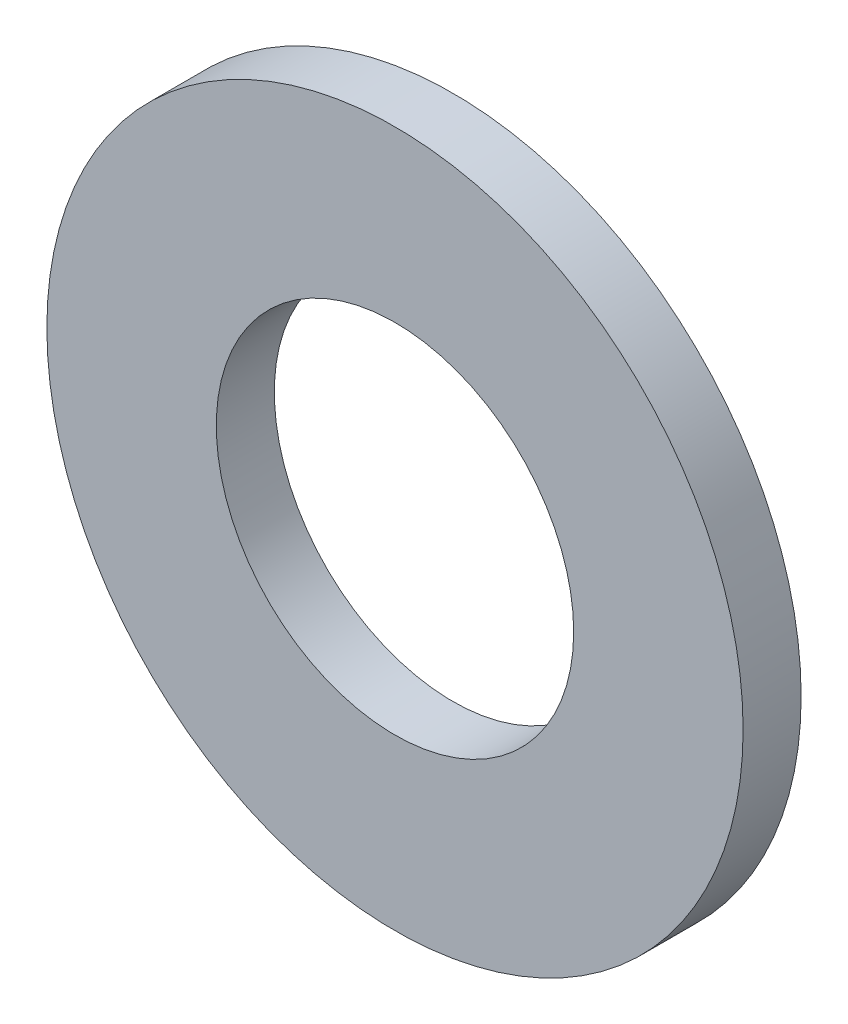
ISO-10303-21;
HEADER;
FILE_DESCRIPTION(('STEP AP214'),'2;1');
FILE_NAME('part.step','',(''),(''),'','','');
FILE_SCHEMA(('AUTOMOTIVE_DESIGN { 1 0 10303 214 1 1 1 1 }'));
ENDSEC;
DATA;
#1=APPLICATION_CONTEXT('core data for automotive mechanical design processes');
#2=APPLICATION_PROTOCOL_DEFINITION('international standard','automotive_design',2000,#1);
#3=PRODUCT_CONTEXT('',#1,'mechanical');
#4=PRODUCT('Part','Part','',(#3));
#5=PRODUCT_RELATED_PRODUCT_CATEGORY('part','',(#4));
#6=PRODUCT_DEFINITION_FORMATION('','',#4);
#7=PRODUCT_DEFINITION_CONTEXT('part definition',#1,'design');
#8=PRODUCT_DEFINITION('design','',#6,#7);
#9=PRODUCT_DEFINITION_SHAPE('','',#8);
#10=(LENGTH_UNIT() NAMED_UNIT(*) SI_UNIT(.MILLI.,.METRE.));
#11=(NAMED_UNIT(*) PLANE_ANGLE_UNIT() SI_UNIT($,.RADIAN.));
#12=(NAMED_UNIT(*) SI_UNIT($,.STERADIAN.) SOLID_ANGLE_UNIT());
#13=UNCERTAINTY_MEASURE_WITH_UNIT(LENGTH_MEASURE(1.E-05),#10,'distance_accuracy_value','');
#14=(GEOMETRIC_REPRESENTATION_CONTEXT(3) GLOBAL_UNCERTAINTY_ASSIGNED_CONTEXT((#13)) GLOBAL_UNIT_ASSIGNED_CONTEXT((#10,
#11,#12)) REPRESENTATION_CONTEXT('',''));
#15=CARTESIAN_POINT('',(0.,0.,0.));
#16=DIRECTION('',(0.,0.,1.));
#17=DIRECTION('',(1.,0.,0.));
#18=AXIS2_PLACEMENT_3D('',#15,#16,#17);
#19=CARTESIAN_POINT('',(0.,0.,1.5875));
#20=DIRECTION('',(0.,0.,1.));
#21=DIRECTION('',(1.,0.,0.));
#22=AXIS2_PLACEMENT_3D('',#19,#20,#21);
#23=PLANE('',#22);
#24=CARTESIAN_POINT('',(0.,0.,1.5875));
#25=DIRECTION('',(0.,0.,1.));
#26=DIRECTION('',(1.,0.,0.));
#27=AXIS2_PLACEMENT_3D('',#24,#25,#26);
#28=CIRCLE('',#27,9.525);
#29=CARTESIAN_POINT('',(9.525,0.,1.5875));
#30=VERTEX_POINT('',#29);
#31=EDGE_CURVE('E10',#30,#30,#28,.T.);
#32=ORIENTED_EDGE('',*,*,#31,.T.);
#33=EDGE_LOOP('',(#32));
#34=FACE_BOUND('',#33,.T.);
#35=CARTESIAN_POINT('',(0.,0.,1.5875));
#36=DIRECTION('',(0.,0.,1.));
#37=DIRECTION('',(1.,0.,0.));
#38=AXIS2_PLACEMENT_3D('',#35,#36,#37);
#39=CIRCLE('',#38,4.8895);
#40=CARTESIAN_POINT('',(4.8895,0.,1.5875));
#41=VERTEX_POINT('',#40);
#42=EDGE_CURVE('E42',#41,#41,#39,.T.);
#43=ORIENTED_EDGE('',*,*,#42,.F.);
#44=EDGE_LOOP('',(#43));
#45=FACE_BOUND('',#44,.T.);
#46=ADVANCED_FACE('F31',(#34,#45),#23,.T.);
#47=CARTESIAN_POINT('',(0.,0.,0.));
#48=DIRECTION('',(0.,0.,1.));
#49=DIRECTION('',(1.,0.,0.));
#50=AXIS2_PLACEMENT_3D('',#47,#48,#49);
#51=PLANE('',#50);
#52=CARTESIAN_POINT('',(0.,0.,0.));
#53=DIRECTION('',(0.,0.,1.));
#54=DIRECTION('',(1.,0.,0.));
#55=AXIS2_PLACEMENT_3D('',#52,#53,#54);
#56=CIRCLE('',#55,9.525);
#57=CARTESIAN_POINT('',(9.525,0.,0.));
#58=VERTEX_POINT('',#57);
#59=EDGE_CURVE('E35',#58,#58,#56,.T.);
#60=ORIENTED_EDGE('',*,*,#59,.F.);
#61=EDGE_LOOP('',(#60));
#62=FACE_BOUND('',#61,.T.);
#63=CARTESIAN_POINT('',(0.,0.,0.));
#64=DIRECTION('',(0.,0.,1.));
#65=DIRECTION('',(1.,0.,0.));
#66=AXIS2_PLACEMENT_3D('',#63,#64,#65);
#67=CIRCLE('',#66,4.8895);
#68=CARTESIAN_POINT('',(4.8895,0.,0.));
#69=VERTEX_POINT('',#68);
#70=EDGE_CURVE('E44',#69,#69,#67,.T.);
#71=ORIENTED_EDGE('',*,*,#70,.T.);
#72=EDGE_LOOP('',(#71));
#73=FACE_BOUND('',#72,.T.);
#74=ADVANCED_FACE('F54',(#62,#73),#51,.F.);
#75=CARTESIAN_POINT('',(0.,0.,1.5875));
#76=DIRECTION('',(0.,0.,-1.));
#77=DIRECTION('',(-1.,0.,0.));
#78=AXIS2_PLACEMENT_3D('',#75,#76,#77);
#79=CYLINDRICAL_SURFACE('',#78,9.525);
#80=ORIENTED_EDGE('',*,*,#31,.F.);
#81=EDGE_LOOP('',(#80));
#82=FACE_BOUND('',#81,.T.);
#83=ORIENTED_EDGE('',*,*,#59,.T.);
#84=EDGE_LOOP('',(#83));
#85=FACE_BOUND('',#84,.T.);
#86=ADVANCED_FACE('F33',(#82,#85),#79,.T.);
#87=CARTESIAN_POINT('',(0.,0.,1.5875));
#88=DIRECTION('',(0.,0.,-1.));
#89=DIRECTION('',(-1.,0.,0.));
#90=AXIS2_PLACEMENT_3D('',#87,#88,#89);
#91=CYLINDRICAL_SURFACE('',#90,4.8895);
#92=ORIENTED_EDGE('',*,*,#42,.T.);
#93=EDGE_LOOP('',(#92));
#94=FACE_BOUND('',#93,.T.);
#95=ORIENTED_EDGE('',*,*,#70,.F.);
#96=EDGE_LOOP('',(#95));
#97=FACE_BOUND('',#96,.T.);
#98=ADVANCED_FACE('F50',(#94,#97),#91,.F.);
#99=CLOSED_SHELL('',(#46,#74,#86,#98));
#100=MANIFOLD_SOLID_BREP('B2',#99);
#101=ADVANCED_BREP_SHAPE_REPRESENTATION('',(#18,#100),#14);
#102=SHAPE_DEFINITION_REPRESENTATION(#9,#101);
ENDSEC;
END-ISO-10303-21;
